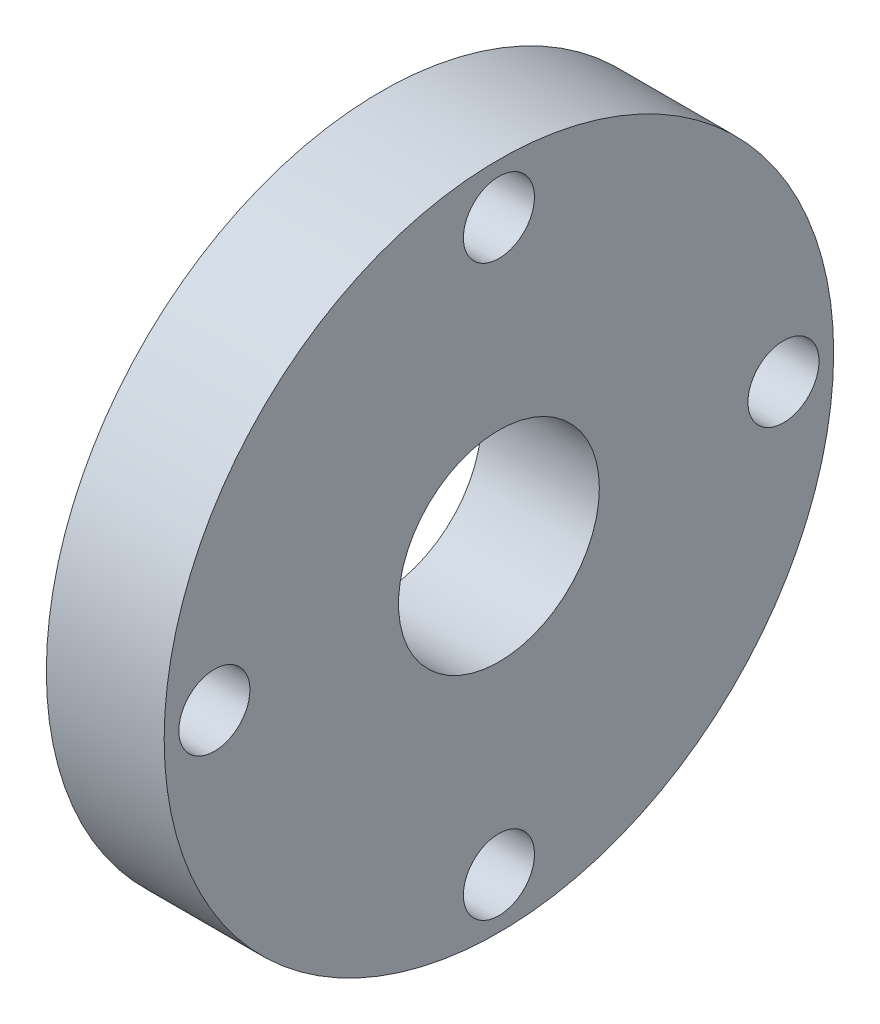
ISO-10303-21;
HEADER;
FILE_DESCRIPTION(('STEP AP214'),'2;1');
FILE_NAME('part.step','',(''),(''),'','','');
FILE_SCHEMA(('AUTOMOTIVE_DESIGN { 1 0 10303 214 1 1 1 1 }'));
ENDSEC;
DATA;
#1=APPLICATION_CONTEXT('core data for automotive mechanical design processes');
#2=APPLICATION_PROTOCOL_DEFINITION('international standard','automotive_design',2000,#1);
#3=PRODUCT_CONTEXT('',#1,'mechanical');
#4=PRODUCT('Part','Part','',(#3));
#5=PRODUCT_RELATED_PRODUCT_CATEGORY('part','',(#4));
#6=PRODUCT_DEFINITION_FORMATION('','',#4);
#7=PRODUCT_DEFINITION_CONTEXT('part definition',#1,'design');
#8=PRODUCT_DEFINITION('design','',#6,#7);
#9=PRODUCT_DEFINITION_SHAPE('','',#8);
#10=(LENGTH_UNIT() NAMED_UNIT(*) SI_UNIT(.MILLI.,.METRE.));
#11=(NAMED_UNIT(*) PLANE_ANGLE_UNIT() SI_UNIT($,.RADIAN.));
#12=(NAMED_UNIT(*) SI_UNIT($,.STERADIAN.) SOLID_ANGLE_UNIT());
#13=UNCERTAINTY_MEASURE_WITH_UNIT(LENGTH_MEASURE(1.E-05),#10,'distance_accuracy_value','');
#14=(GEOMETRIC_REPRESENTATION_CONTEXT(3) GLOBAL_UNCERTAINTY_ASSIGNED_CONTEXT((#13)) GLOBAL_UNIT_ASSIGNED_CONTEXT((#10,
#11,#12)) REPRESENTATION_CONTEXT('',''));
#15=CARTESIAN_POINT('',(0.,0.,0.));
#16=DIRECTION('',(0.,0.,1.));
#17=DIRECTION('',(1.,0.,0.));
#18=AXIS2_PLACEMENT_3D('',#15,#16,#17);
#19=CARTESIAN_POINT('',(-104.648,0.,-53.975));
#20=DIRECTION('',(1.,0.,0.));
#21=DIRECTION('',(0.,0.,-1.));
#22=AXIS2_PLACEMENT_3D('',#19,#20,#21);
#23=CYLINDRICAL_SURFACE('',#22,4.3688);
#24=CARTESIAN_POINT('',(0.,0.,-53.975));
#25=DIRECTION('',(1.,0.,0.));
#26=DIRECTION('',(0.,0.,-1.));
#27=AXIS2_PLACEMENT_3D('',#24,#25,#26);
#28=CIRCLE('',#27,4.3688);
#29=CARTESIAN_POINT('',(0.,0.,-58.3438));
#30=VERTEX_POINT('',#29);
#31=EDGE_CURVE('E71',#30,#30,#28,.T.);
#32=ORIENTED_EDGE('',*,*,#31,.F.);
#33=EDGE_LOOP('',(#32));
#34=FACE_BOUND('',#33,.T.);
#35=CARTESIAN_POINT('',(12.7,0.,-53.975));
#36=DIRECTION('',(1.,0.,0.));
#37=DIRECTION('',(0.,0.,-1.));
#38=AXIS2_PLACEMENT_3D('',#35,#36,#37);
#39=CIRCLE('',#38,4.3688);
#40=CARTESIAN_POINT('',(12.7,0.,-58.3438));
#41=VERTEX_POINT('',#40);
#42=EDGE_CURVE('E45',#41,#41,#39,.F.);
#43=ORIENTED_EDGE('',*,*,#42,.F.);
#44=EDGE_LOOP('',(#43));
#45=FACE_BOUND('',#44,.T.);
#46=ADVANCED_FACE('F41',(#34,#45),#23,.F.);
#47=CARTESIAN_POINT('',(-104.648,-53.975,0.));
#48=DIRECTION('',(1.,0.,0.));
#49=DIRECTION('',(0.,0.,-1.));
#50=AXIS2_PLACEMENT_3D('',#47,#48,#49);
#51=CYLINDRICAL_SURFACE('',#50,4.3688);
#52=CARTESIAN_POINT('',(0.,-53.975,0.));
#53=DIRECTION('',(1.,0.,0.));
#54=DIRECTION('',(0.,0.,-1.));
#55=AXIS2_PLACEMENT_3D('',#52,#53,#54);
#56=CIRCLE('',#55,4.3688);
#57=CARTESIAN_POINT('',(0.,-53.975,-4.3688));
#58=VERTEX_POINT('',#57);
#59=EDGE_CURVE('E75',#58,#58,#56,.T.);
#60=ORIENTED_EDGE('',*,*,#59,.F.);
#61=EDGE_LOOP('',(#60));
#62=FACE_BOUND('',#61,.T.);
#63=CARTESIAN_POINT('',(12.7,-53.975,0.));
#64=DIRECTION('',(1.,0.,0.));
#65=DIRECTION('',(0.,0.,-1.));
#66=AXIS2_PLACEMENT_3D('',#63,#64,#65);
#67=CIRCLE('',#66,4.3688);
#68=CARTESIAN_POINT('',(12.7,-53.975,-4.3688));
#69=VERTEX_POINT('',#68);
#70=EDGE_CURVE('E65',#69,#69,#67,.F.);
#71=ORIENTED_EDGE('',*,*,#70,.F.);
#72=EDGE_LOOP('',(#71));
#73=FACE_BOUND('',#72,.T.);
#74=ADVANCED_FACE('F119',(#62,#73),#51,.F.);
#75=CARTESIAN_POINT('',(-104.648,0.,53.975));
#76=DIRECTION('',(1.,0.,0.));
#77=DIRECTION('',(0.,0.,-1.));
#78=AXIS2_PLACEMENT_3D('',#75,#76,#77);
#79=CYLINDRICAL_SURFACE('',#78,4.3688);
#80=CARTESIAN_POINT('',(0.,0.,53.975));
#81=DIRECTION('',(1.,0.,0.));
#82=DIRECTION('',(0.,0.,-1.));
#83=AXIS2_PLACEMENT_3D('',#80,#81,#82);
#84=CIRCLE('',#83,4.3688);
#85=CARTESIAN_POINT('',(0.,0.,49.6062));
#86=VERTEX_POINT('',#85);
#87=EDGE_CURVE('E80',#86,#86,#84,.T.);
#88=ORIENTED_EDGE('',*,*,#87,.F.);
#89=EDGE_LOOP('',(#88));
#90=FACE_BOUND('',#89,.T.);
#91=CARTESIAN_POINT('',(12.7,0.,53.975));
#92=DIRECTION('',(1.,0.,0.));
#93=DIRECTION('',(0.,0.,-1.));
#94=AXIS2_PLACEMENT_3D('',#91,#92,#93);
#95=CIRCLE('',#94,4.3688);
#96=CARTESIAN_POINT('',(12.7,0.,49.6062));
#97=VERTEX_POINT('',#96);
#98=EDGE_CURVE('E63',#97,#97,#95,.F.);
#99=ORIENTED_EDGE('',*,*,#98,.F.);
#100=EDGE_LOOP('',(#99));
#101=FACE_BOUND('',#100,.T.);
#102=ADVANCED_FACE('F125',(#90,#101),#79,.F.);
#103=CARTESIAN_POINT('',(-104.648,53.975,0.));
#104=DIRECTION('',(1.,0.,0.));
#105=DIRECTION('',(0.,0.,-1.));
#106=AXIS2_PLACEMENT_3D('',#103,#104,#105);
#107=CYLINDRICAL_SURFACE('',#106,4.3688);
#108=CARTESIAN_POINT('',(0.,53.975,0.));
#109=DIRECTION('',(1.,0.,0.));
#110=DIRECTION('',(0.,0.,-1.));
#111=AXIS2_PLACEMENT_3D('',#108,#109,#110);
#112=CIRCLE('',#111,4.3688);
#113=CARTESIAN_POINT('',(0.,53.975,-4.3688));
#114=VERTEX_POINT('',#113);
#115=EDGE_CURVE('E61',#114,#114,#112,.T.);
#116=ORIENTED_EDGE('',*,*,#115,.F.);
#117=EDGE_LOOP('',(#116));
#118=FACE_BOUND('',#117,.T.);
#119=CARTESIAN_POINT('',(12.7,53.975,0.));
#120=DIRECTION('',(1.,0.,0.));
#121=DIRECTION('',(0.,0.,-1.));
#122=AXIS2_PLACEMENT_3D('',#119,#120,#121);
#123=CIRCLE('',#122,4.3688);
#124=CARTESIAN_POINT('',(12.7,53.975,-4.3688));
#125=VERTEX_POINT('',#124);
#126=EDGE_CURVE('E58',#125,#125,#123,.F.);
#127=ORIENTED_EDGE('',*,*,#126,.F.);
#128=EDGE_LOOP('',(#127));
#129=FACE_BOUND('',#128,.T.);
#130=ADVANCED_FACE('F116',(#118,#129),#107,.F.);
#131=CARTESIAN_POINT('',(0.,0.,0.));
#132=DIRECTION('',(1.,0.,0.));
#133=DIRECTION('',(0.,0.,-1.));
#134=AXIS2_PLACEMENT_3D('',#131,#132,#133);
#135=PLANE('',#134);
#136=ORIENTED_EDGE('',*,*,#87,.T.);
#137=EDGE_LOOP('',(#136));
#138=FACE_BOUND('',#137,.T.);
#139=ORIENTED_EDGE('',*,*,#59,.T.);
#140=EDGE_LOOP('',(#139));
#141=FACE_BOUND('',#140,.T.);
#142=ORIENTED_EDGE('',*,*,#31,.T.);
#143=EDGE_LOOP('',(#142));
#144=FACE_BOUND('',#143,.T.);
#145=ORIENTED_EDGE('',*,*,#115,.T.);
#146=EDGE_LOOP('',(#145));
#147=FACE_BOUND('',#146,.T.);
#148=CARTESIAN_POINT('',(0.,0.,0.));
#149=DIRECTION('',(1.,0.,0.));
#150=DIRECTION('',(0.,0.,-1.));
#151=AXIS2_PLACEMENT_3D('',#148,#149,#150);
#152=CIRCLE('',#151,19.05);
#153=CARTESIAN_POINT('',(0.,0.,-19.05));
#154=VERTEX_POINT('',#153);
#155=EDGE_CURVE('E54',#154,#154,#152,.T.);
#156=ORIENTED_EDGE('',*,*,#155,.T.);
#157=EDGE_LOOP('',(#156));
#158=FACE_BOUND('',#157,.T.);
#159=CARTESIAN_POINT('',(0.,0.,0.));
#160=DIRECTION('',(-1.,0.,0.));
#161=DIRECTION('',(0.,0.,1.));
#162=AXIS2_PLACEMENT_3D('',#159,#160,#161);
#163=CIRCLE('',#162,63.5);
#164=CARTESIAN_POINT('',(0.,0.,63.5));
#165=VERTEX_POINT('',#164);
#166=EDGE_CURVE('E10',#165,#165,#163,.T.);
#167=ORIENTED_EDGE('',*,*,#166,.T.);
#168=EDGE_LOOP('',(#167));
#169=FACE_BOUND('',#168,.T.);
#170=ADVANCED_FACE('F43',(#138,#141,#144,#147,#158,#169),#135,.F.);
#171=CARTESIAN_POINT('',(-25.4,0.,0.));
#172=DIRECTION('',(-1.,0.,0.));
#173=DIRECTION('',(0.,0.,1.));
#174=AXIS2_PLACEMENT_3D('',#171,#172,#173);
#175=CYLINDRICAL_SURFACE('',#174,63.5);
#176=ORIENTED_EDGE('',*,*,#166,.F.);
#177=EDGE_LOOP('',(#176));
#178=FACE_BOUND('',#177,.T.);
#179=CARTESIAN_POINT('',(22.352,0.,0.));
#180=DIRECTION('',(-1.,0.,0.));
#181=DIRECTION('',(0.,0.,1.));
#182=AXIS2_PLACEMENT_3D('',#179,#180,#181);
#183=CIRCLE('',#182,63.5);
#184=CARTESIAN_POINT('',(22.352,0.,63.5));
#185=VERTEX_POINT('',#184);
#186=EDGE_CURVE('E49',#185,#185,#183,.T.);
#187=ORIENTED_EDGE('',*,*,#186,.T.);
#188=EDGE_LOOP('',(#187));
#189=FACE_BOUND('',#188,.T.);
#190=ADVANCED_FACE('F105',(#178,#189),#175,.T.);
#191=CARTESIAN_POINT('',(22.352,63.5,0.));
#192=DIRECTION('',(-1.,0.,0.));
#193=DIRECTION('',(0.,0.,1.));
#194=AXIS2_PLACEMENT_3D('',#191,#192,#193);
#195=PLANE('',#194);
#196=CARTESIAN_POINT('',(22.352,0.,53.975));
#197=DIRECTION('',(1.,0.,0.));
#198=DIRECTION('',(0.,0.,-1.));
#199=AXIS2_PLACEMENT_3D('',#196,#197,#198);
#200=CIRCLE('',#199,6.7437);
#201=CARTESIAN_POINT('',(22.352,0.,47.2313));
#202=VERTEX_POINT('',#201);
#203=EDGE_CURVE('E286',#202,#202,#200,.T.);
#204=ORIENTED_EDGE('',*,*,#203,.F.);
#205=EDGE_LOOP('',(#204));
#206=FACE_BOUND('',#205,.T.);
#207=CARTESIAN_POINT('',(22.352,-53.975,0.));
#208=DIRECTION('',(1.,0.,0.));
#209=DIRECTION('',(0.,0.,-1.));
#210=AXIS2_PLACEMENT_3D('',#207,#208,#209);
#211=CIRCLE('',#210,6.7437);
#212=CARTESIAN_POINT('',(22.352,-53.975,-6.7437));
#213=VERTEX_POINT('',#212);
#214=EDGE_CURVE('E281',#213,#213,#211,.T.);
#215=ORIENTED_EDGE('',*,*,#214,.F.);
#216=EDGE_LOOP('',(#215));
#217=FACE_BOUND('',#216,.T.);
#218=CARTESIAN_POINT('',(22.352,0.,-53.975));
#219=DIRECTION('',(1.,0.,0.));
#220=DIRECTION('',(0.,0.,-1.));
#221=AXIS2_PLACEMENT_3D('',#218,#219,#220);
#222=CIRCLE('',#221,6.7437);
#223=CARTESIAN_POINT('',(22.352,0.,-60.7187));
#224=VERTEX_POINT('',#223);
#225=EDGE_CURVE('E277',#224,#224,#222,.T.);
#226=ORIENTED_EDGE('',*,*,#225,.F.);
#227=EDGE_LOOP('',(#226));
#228=FACE_BOUND('',#227,.T.);
#229=CARTESIAN_POINT('',(22.352,53.975,0.));
#230=DIRECTION('',(1.,0.,0.));
#231=DIRECTION('',(0.,0.,-1.));
#232=AXIS2_PLACEMENT_3D('',#229,#230,#231);
#233=CIRCLE('',#232,6.7437);
#234=CARTESIAN_POINT('',(22.352,53.975,-6.7437));
#235=VERTEX_POINT('',#234);
#236=EDGE_CURVE('E88',#235,#235,#233,.T.);
#237=ORIENTED_EDGE('',*,*,#236,.F.);
#238=EDGE_LOOP('',(#237));
#239=FACE_BOUND('',#238,.T.);
#240=CARTESIAN_POINT('',(22.352,0.,0.));
#241=DIRECTION('',(1.,0.,0.));
#242=DIRECTION('',(0.,0.,-1.));
#243=AXIS2_PLACEMENT_3D('',#240,#241,#242);
#244=CIRCLE('',#243,19.05);
#245=CARTESIAN_POINT('',(22.352,0.,-19.05));
#246=VERTEX_POINT('',#245);
#247=EDGE_CURVE('E95',#246,#246,#244,.T.);
#248=ORIENTED_EDGE('',*,*,#247,.F.);
#249=EDGE_LOOP('',(#248));
#250=FACE_BOUND('',#249,.T.);
#251=ORIENTED_EDGE('',*,*,#186,.F.);
#252=EDGE_LOOP('',(#251));
#253=FACE_BOUND('',#252,.T.);
#254=ADVANCED_FACE('F102',(#206,#217,#228,#239,#250,#253),#195,.F.);
#255=CARTESIAN_POINT('',(0.,0.,0.));
#256=DIRECTION('',(1.,0.,0.));
#257=DIRECTION('',(0.,0.,-1.));
#258=AXIS2_PLACEMENT_3D('',#255,#256,#257);
#259=CYLINDRICAL_SURFACE('',#258,19.05);
#260=ORIENTED_EDGE('',*,*,#155,.F.);
#261=EDGE_LOOP('',(#260));
#262=FACE_BOUND('',#261,.T.);
#263=ORIENTED_EDGE('',*,*,#247,.T.);
#264=EDGE_LOOP('',(#263));
#265=FACE_BOUND('',#264,.T.);
#266=ADVANCED_FACE('F100',(#262,#265),#259,.F.);
#267=CARTESIAN_POINT('',(12.7,53.975,0.));
#268=DIRECTION('',(1.,0.,0.));
#269=DIRECTION('',(0.,0.,-1.));
#270=AXIS2_PLACEMENT_3D('',#267,#268,#269);
#271=PLANE('',#270);
#272=CARTESIAN_POINT('',(12.7,53.975,0.));
#273=DIRECTION('',(1.,0.,0.));
#274=DIRECTION('',(0.,0.,-1.));
#275=AXIS2_PLACEMENT_3D('',#272,#273,#274);
#276=CIRCLE('',#275,6.7437);
#277=CARTESIAN_POINT('',(12.7,53.975,-6.7437));
#278=VERTEX_POINT('',#277);
#279=EDGE_CURVE('E62',#278,#278,#276,.T.);
#280=ORIENTED_EDGE('',*,*,#279,.T.);
#281=EDGE_LOOP('',(#280));
#282=FACE_BOUND('',#281,.T.);
#283=ORIENTED_EDGE('',*,*,#126,.T.);
#284=EDGE_LOOP('',(#283));
#285=FACE_BOUND('',#284,.T.);
#286=ADVANCED_FACE('F131',(#282,#285),#271,.T.);
#287=CARTESIAN_POINT('',(12.7,53.975,0.));
#288=DIRECTION('',(1.,0.,0.));
#289=DIRECTION('',(0.,0.,-1.));
#290=AXIS2_PLACEMENT_3D('',#287,#288,#289);
#291=CYLINDRICAL_SURFACE('',#290,6.7437);
#292=ORIENTED_EDGE('',*,*,#279,.F.);
#293=EDGE_LOOP('',(#292));
#294=FACE_BOUND('',#293,.T.);
#295=ORIENTED_EDGE('',*,*,#236,.T.);
#296=EDGE_LOOP('',(#295));
#297=FACE_BOUND('',#296,.T.);
#298=ADVANCED_FACE('F134',(#294,#297),#291,.F.);
#299=CARTESIAN_POINT('',(12.7,0.,53.975));
#300=DIRECTION('',(1.,0.,0.));
#301=DIRECTION('',(0.,0.,-1.));
#302=AXIS2_PLACEMENT_3D('',#299,#300,#301);
#303=PLANE('',#302);
#304=CARTESIAN_POINT('',(12.7,0.,53.975));
#305=DIRECTION('',(1.,0.,0.));
#306=DIRECTION('',(0.,0.,-1.));
#307=AXIS2_PLACEMENT_3D('',#304,#305,#306);
#308=CIRCLE('',#307,6.7437);
#309=CARTESIAN_POINT('',(12.7,0.,47.2313));
#310=VERTEX_POINT('',#309);
#311=EDGE_CURVE('E66',#310,#310,#308,.T.);
#312=ORIENTED_EDGE('',*,*,#311,.T.);
#313=EDGE_LOOP('',(#312));
#314=FACE_BOUND('',#313,.T.);
#315=ORIENTED_EDGE('',*,*,#98,.T.);
#316=EDGE_LOOP('',(#315));
#317=FACE_BOUND('',#316,.T.);
#318=ADVANCED_FACE('F138',(#314,#317),#303,.T.);
#319=CARTESIAN_POINT('',(12.7,0.,53.975));
#320=DIRECTION('',(1.,0.,0.));
#321=DIRECTION('',(0.,0.,-1.));
#322=AXIS2_PLACEMENT_3D('',#319,#320,#321);
#323=CYLINDRICAL_SURFACE('',#322,6.7437);
#324=ORIENTED_EDGE('',*,*,#311,.F.);
#325=EDGE_LOOP('',(#324));
#326=FACE_BOUND('',#325,.T.);
#327=ORIENTED_EDGE('',*,*,#203,.T.);
#328=EDGE_LOOP('',(#327));
#329=FACE_BOUND('',#328,.T.);
#330=ADVANCED_FACE('F189',(#326,#329),#323,.F.);
#331=CARTESIAN_POINT('',(12.7,-53.975,0.));
#332=DIRECTION('',(1.,0.,0.));
#333=DIRECTION('',(0.,0.,-1.));
#334=AXIS2_PLACEMENT_3D('',#331,#332,#333);
#335=PLANE('',#334);
#336=CARTESIAN_POINT('',(12.7,-53.975,0.));
#337=DIRECTION('',(1.,0.,0.));
#338=DIRECTION('',(0.,0.,-1.));
#339=AXIS2_PLACEMENT_3D('',#336,#337,#338);
#340=CIRCLE('',#339,6.7437);
#341=CARTESIAN_POINT('',(12.7,-53.975,-6.7437));
#342=VERTEX_POINT('',#341);
#343=EDGE_CURVE('E279',#342,#342,#340,.T.);
#344=ORIENTED_EDGE('',*,*,#343,.T.);
#345=EDGE_LOOP('',(#344));
#346=FACE_BOUND('',#345,.T.);
#347=ORIENTED_EDGE('',*,*,#70,.T.);
#348=EDGE_LOOP('',(#347));
#349=FACE_BOUND('',#348,.T.);
#350=ADVANCED_FACE('F199',(#346,#349),#335,.T.);
#351=CARTESIAN_POINT('',(12.7,-53.975,0.));
#352=DIRECTION('',(1.,0.,0.));
#353=DIRECTION('',(0.,0.,-1.));
#354=AXIS2_PLACEMENT_3D('',#351,#352,#353);
#355=CYLINDRICAL_SURFACE('',#354,6.7437);
#356=ORIENTED_EDGE('',*,*,#343,.F.);
#357=EDGE_LOOP('',(#356));
#358=FACE_BOUND('',#357,.T.);
#359=ORIENTED_EDGE('',*,*,#214,.T.);
#360=EDGE_LOOP('',(#359));
#361=FACE_BOUND('',#360,.T.);
#362=ADVANCED_FACE('F208',(#358,#361),#355,.F.);
#363=CARTESIAN_POINT('',(12.7,0.,-53.975));
#364=DIRECTION('',(1.,0.,0.));
#365=DIRECTION('',(0.,0.,-1.));
#366=AXIS2_PLACEMENT_3D('',#363,#364,#365);
#367=PLANE('',#366);
#368=CARTESIAN_POINT('',(12.7,0.,-53.975));
#369=DIRECTION('',(1.,0.,0.));
#370=DIRECTION('',(0.,0.,-1.));
#371=AXIS2_PLACEMENT_3D('',#368,#369,#370);
#372=CIRCLE('',#371,6.7437);
#373=CARTESIAN_POINT('',(12.7,0.,-60.7187));
#374=VERTEX_POINT('',#373);
#375=EDGE_CURVE('E83',#374,#374,#372,.T.);
#376=ORIENTED_EDGE('',*,*,#375,.T.);
#377=EDGE_LOOP('',(#376));
#378=FACE_BOUND('',#377,.T.);
#379=ORIENTED_EDGE('',*,*,#42,.T.);
#380=EDGE_LOOP('',(#379));
#381=FACE_BOUND('',#380,.T.);
#382=ADVANCED_FACE('F217',(#378,#381),#367,.T.);
#383=CARTESIAN_POINT('',(12.7,0.,-53.975));
#384=DIRECTION('',(1.,0.,0.));
#385=DIRECTION('',(0.,0.,-1.));
#386=AXIS2_PLACEMENT_3D('',#383,#384,#385);
#387=CYLINDRICAL_SURFACE('',#386,6.7437);
#388=ORIENTED_EDGE('',*,*,#375,.F.);
#389=EDGE_LOOP('',(#388));
#390=FACE_BOUND('',#389,.T.);
#391=ORIENTED_EDGE('',*,*,#225,.T.);
#392=EDGE_LOOP('',(#391));
#393=FACE_BOUND('',#392,.T.);
#394=ADVANCED_FACE('F226',(#390,#393),#387,.F.);
#395=CLOSED_SHELL('',(#46,#74,#102,#130,#170,#190,#254,#266,#286,#298,#318,#330,#350,#362,#382,#394));
#396=MANIFOLD_SOLID_BREP('B2',#395);
#397=ADVANCED_BREP_SHAPE_REPRESENTATION('',(#18,#396),#14);
#398=SHAPE_DEFINITION_REPRESENTATION(#9,#397);
ENDSEC;
END-ISO-10303-21;
